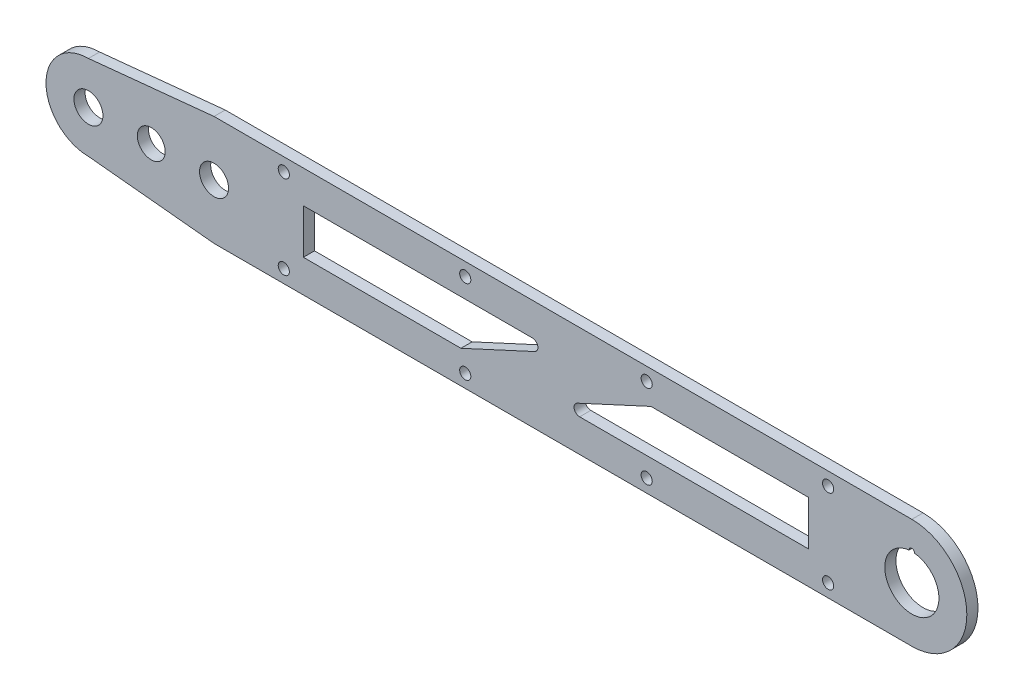
ISO-10303-21;
HEADER;
FILE_DESCRIPTION(('STEP AP214'),'2;1');
FILE_NAME('part.step','',(''),(''),'','','');
FILE_SCHEMA(('AUTOMOTIVE_DESIGN { 1 0 10303 214 1 1 1 1 }'));
ENDSEC;
DATA;
#1=APPLICATION_CONTEXT('core data for automotive mechanical design processes');
#2=APPLICATION_PROTOCOL_DEFINITION('international standard','automotive_design',2000,#1);
#3=PRODUCT_CONTEXT('',#1,'mechanical');
#4=PRODUCT('Part','Part','',(#3));
#5=PRODUCT_RELATED_PRODUCT_CATEGORY('part','',(#4));
#6=PRODUCT_DEFINITION_FORMATION('','',#4);
#7=PRODUCT_DEFINITION_CONTEXT('part definition',#1,'design');
#8=PRODUCT_DEFINITION('design','',#6,#7);
#9=PRODUCT_DEFINITION_SHAPE('','',#8);
#10=(LENGTH_UNIT() NAMED_UNIT(*) SI_UNIT(.MILLI.,.METRE.));
#11=(NAMED_UNIT(*) PLANE_ANGLE_UNIT() SI_UNIT($,.RADIAN.));
#12=(NAMED_UNIT(*) SI_UNIT($,.STERADIAN.) SOLID_ANGLE_UNIT());
#13=UNCERTAINTY_MEASURE_WITH_UNIT(LENGTH_MEASURE(1.E-05),#10,'distance_accuracy_value','');
#14=(GEOMETRIC_REPRESENTATION_CONTEXT(3) GLOBAL_UNCERTAINTY_ASSIGNED_CONTEXT((#13)) GLOBAL_UNIT_ASSIGNED_CONTEXT((#10,
#11,#12)) REPRESENTATION_CONTEXT('',''));
#15=CARTESIAN_POINT('',(0.,0.,0.));
#16=DIRECTION('',(0.,0.,1.));
#17=DIRECTION('',(1.,0.,0.));
#18=AXIS2_PLACEMENT_3D('',#15,#16,#17);
#19=CARTESIAN_POINT('',(-45.,0.,4.));
#20=DIRECTION('',(0.,0.,-1.));
#21=DIRECTION('',(-1.,0.,0.));
#22=AXIS2_PLACEMENT_3D('',#19,#20,#21);
#23=PLANE('',#22);
#24=DIRECTION('',(1.,0.,0.));
#25=VECTOR('',#24,1.);
#26=CARTESIAN_POINT('',(213.,-8.,4.));
#27=LINE('',#26,#25);
#28=CARTESIAN_POINT('',(130.976731594915,-8.,4.));
#29=VERTEX_POINT('',#28);
#30=CARTESIAN_POINT('',(213.,-8.,4.));
#31=VERTEX_POINT('',#30);
#32=EDGE_CURVE('E340',#29,#31,#27,.T.);
#33=ORIENTED_EDGE('',*,*,#32,.F.);
#34=CARTESIAN_POINT('',(130.976731594915,-6.,4.));
#35=DIRECTION('',(0.,0.,1.));
#36=DIRECTION('',(-1.,0.,0.));
#37=AXIS2_PLACEMENT_3D('',#34,#35,#36);
#38=CIRCLE('',#37,2.);
#39=CARTESIAN_POINT('',(130.138615239991,-4.18408123099903,4.));
#40=VERTEX_POINT('',#39);
#41=EDGE_CURVE('E61',#40,#29,#38,.T.);
#42=ORIENTED_EDGE('',*,*,#41,.F.);
#43=DIRECTION('',(-0.907959384500451,-0.419058177461749,0.));
#44=VECTOR('',#43,1.);
#45=CARTESIAN_POINT('',(130.138615239991,-4.18408123099903,4.));
#46=LINE('',#45,#44);
#47=CARTESIAN_POINT('',(156.537457907156,8.,4.));
#48=VERTEX_POINT('',#47);
#49=EDGE_CURVE('E353',#48,#40,#46,.T.);
#50=ORIENTED_EDGE('',*,*,#49,.F.);
#51=DIRECTION('',(-1.,0.,0.));
#52=VECTOR('',#51,1.);
#53=CARTESIAN_POINT('',(156.537457907156,8.,4.));
#54=LINE('',#53,#52);
#55=CARTESIAN_POINT('',(213.,8.,4.));
#56=VERTEX_POINT('',#55);
#57=EDGE_CURVE('E349',#56,#48,#54,.T.);
#58=ORIENTED_EDGE('',*,*,#57,.F.);
#59=DIRECTION('',(0.,1.,0.));
#60=VECTOR('',#59,1.);
#61=CARTESIAN_POINT('',(213.,8.,4.));
#62=LINE('',#61,#60);
#63=EDGE_CURVE('E345',#31,#56,#62,.T.);
#64=ORIENTED_EDGE('',*,*,#63,.F.);
#65=EDGE_LOOP('',(#33,#42,#50,#58,#64));
#66=FACE_BOUND('',#65,.T.);
#67=DIRECTION('',(0.,-1.,0.));
#68=VECTOR('',#67,1.);
#69=CARTESIAN_POINT('',(32.,8.,4.));
#70=LINE('',#69,#68);
#71=CARTESIAN_POINT('',(32.,8.,4.));
#72=VERTEX_POINT('',#71);
#73=CARTESIAN_POINT('',(32.,-8.,4.));
#74=VERTEX_POINT('',#73);
#75=EDGE_CURVE('E373',#72,#74,#70,.T.);
#76=ORIENTED_EDGE('',*,*,#75,.F.);
#77=DIRECTION('',(-1.,0.,0.));
#78=VECTOR('',#77,1.);
#79=CARTESIAN_POINT('',(114.023268405085,8.,4.));
#80=LINE('',#79,#78);
#81=CARTESIAN_POINT('',(114.023268405085,8.,4.));
#82=VERTEX_POINT('',#81);
#83=EDGE_CURVE('E335',#82,#72,#80,.T.);
#84=ORIENTED_EDGE('',*,*,#83,.F.);
#85=CARTESIAN_POINT('',(114.023268405086,6.,4.));
#86=DIRECTION('',(0.,0.,1.));
#87=DIRECTION('',(1.,0.,0.));
#88=AXIS2_PLACEMENT_3D('',#85,#86,#87);
#89=CIRCLE('',#88,2.);
#90=CARTESIAN_POINT('',(114.861384760009,4.18408123099903,4.));
#91=VERTEX_POINT('',#90);
#92=EDGE_CURVE('E385',#91,#82,#89,.T.);
#93=ORIENTED_EDGE('',*,*,#92,.F.);
#94=DIRECTION('',(0.907959384500451,0.419058177461749,0.));
#95=VECTOR('',#94,1.);
#96=CARTESIAN_POINT('',(88.4625420928446,-8.,4.));
#97=LINE('',#96,#95);
#98=CARTESIAN_POINT('',(88.4625420928446,-8.,4.));
#99=VERTEX_POINT('',#98);
#100=EDGE_CURVE('E381',#99,#91,#97,.T.);
#101=ORIENTED_EDGE('',*,*,#100,.F.);
#102=DIRECTION('',(1.,0.,0.));
#103=VECTOR('',#102,1.);
#104=CARTESIAN_POINT('',(32.,-8.,4.));
#105=LINE('',#104,#103);
#106=EDGE_CURVE('E377',#74,#99,#105,.T.);
#107=ORIENTED_EDGE('',*,*,#106,.F.);
#108=EDGE_LOOP('',(#76,#84,#93,#101,#107));
#109=FACE_BOUND('',#108,.T.);
#110=CARTESIAN_POINT('',(-22.5,0.,4.));
#111=DIRECTION('',(0.,0.,1.));
#112=DIRECTION('',(1.,0.,0.));
#113=AXIS2_PLACEMENT_3D('',#110,#111,#112);
#114=CIRCLE('',#113,5.);
#115=CARTESIAN_POINT('',(-17.5,0.,4.));
#116=VERTEX_POINT('',#115);
#117=EDGE_CURVE('E331',#116,#116,#114,.T.);
#118=ORIENTED_EDGE('',*,*,#117,.F.);
#119=EDGE_LOOP('',(#118));
#120=FACE_BOUND('',#119,.T.);
#121=CARTESIAN_POINT('',(90.0000000000003,-15.,4.));
#122=DIRECTION('',(0.,0.,1.));
#123=DIRECTION('',(1.,0.,0.));
#124=AXIS2_PLACEMENT_3D('',#121,#122,#123);
#125=CIRCLE('',#124,2.);
#126=CARTESIAN_POINT('',(92.0000000000003,-15.,4.));
#127=VERTEX_POINT('',#126);
#128=EDGE_CURVE('E408',#127,#127,#125,.T.);
#129=ORIENTED_EDGE('',*,*,#128,.F.);
#130=EDGE_LOOP('',(#129));
#131=FACE_BOUND('',#130,.T.);
#132=CARTESIAN_POINT('',(220.,15.,4.));
#133=DIRECTION('',(0.,0.,1.));
#134=DIRECTION('',(1.,0.,0.));
#135=AXIS2_PLACEMENT_3D('',#132,#133,#134);
#136=CIRCLE('',#135,2.);
#137=CARTESIAN_POINT('',(222.,15.,4.));
#138=VERTEX_POINT('',#137);
#139=EDGE_CURVE('E416',#138,#138,#136,.T.);
#140=ORIENTED_EDGE('',*,*,#139,.F.);
#141=EDGE_LOOP('',(#140));
#142=FACE_BOUND('',#141,.T.);
#143=CARTESIAN_POINT('',(155.,15.,4.));
#144=DIRECTION('',(0.,0.,1.));
#145=DIRECTION('',(1.,0.,0.));
#146=AXIS2_PLACEMENT_3D('',#143,#144,#145);
#147=CIRCLE('',#146,2.);
#148=CARTESIAN_POINT('',(157.,15.,4.));
#149=VERTEX_POINT('',#148);
#150=EDGE_CURVE('E420',#149,#149,#147,.T.);
#151=ORIENTED_EDGE('',*,*,#150,.F.);
#152=EDGE_LOOP('',(#151));
#153=FACE_BOUND('',#152,.T.);
#154=CARTESIAN_POINT('',(90.,15.,4.));
#155=DIRECTION('',(0.,0.,1.));
#156=DIRECTION('',(1.,0.,0.));
#157=AXIS2_PLACEMENT_3D('',#154,#155,#156);
#158=CIRCLE('',#157,2.);
#159=CARTESIAN_POINT('',(92.,15.,4.));
#160=VERTEX_POINT('',#159);
#161=EDGE_CURVE('E424',#160,#160,#158,.T.);
#162=ORIENTED_EDGE('',*,*,#161,.F.);
#163=EDGE_LOOP('',(#162));
#164=FACE_BOUND('',#163,.T.);
#165=CARTESIAN_POINT('',(155.,-15.,4.));
#166=DIRECTION('',(0.,0.,1.));
#167=DIRECTION('',(1.,0.,0.));
#168=AXIS2_PLACEMENT_3D('',#165,#166,#167);
#169=CIRCLE('',#168,2.);
#170=CARTESIAN_POINT('',(157.,-15.,4.));
#171=VERTEX_POINT('',#170);
#172=EDGE_CURVE('E404',#171,#171,#169,.T.);
#173=ORIENTED_EDGE('',*,*,#172,.F.);
#174=EDGE_LOOP('',(#173));
#175=FACE_BOUND('',#174,.T.);
#176=CARTESIAN_POINT('',(220.,-15.,4.));
#177=DIRECTION('',(0.,0.,1.));
#178=DIRECTION('',(1.,0.,0.));
#179=AXIS2_PLACEMENT_3D('',#176,#177,#178);
#180=CIRCLE('',#179,2.);
#181=CARTESIAN_POINT('',(222.,-15.,4.));
#182=VERTEX_POINT('',#181);
#183=EDGE_CURVE('E409',#182,#182,#180,.T.);
#184=ORIENTED_EDGE('',*,*,#183,.F.);
#185=EDGE_LOOP('',(#184));
#186=FACE_BOUND('',#185,.T.);
#187=CARTESIAN_POINT('',(25.0000000000003,-15.,4.));
#188=DIRECTION('',(0.,0.,1.));
#189=DIRECTION('',(1.,0.,0.));
#190=AXIS2_PLACEMENT_3D('',#187,#188,#189);
#191=CIRCLE('',#190,2.);
#192=CARTESIAN_POINT('',(27.0000000000003,-15.,4.));
#193=VERTEX_POINT('',#192);
#194=EDGE_CURVE('E294',#193,#193,#191,.T.);
#195=ORIENTED_EDGE('',*,*,#194,.F.);
#196=EDGE_LOOP('',(#195));
#197=FACE_BOUND('',#196,.T.);
#198=CARTESIAN_POINT('',(25.,15.,4.));
#199=DIRECTION('',(0.,0.,1.));
#200=DIRECTION('',(1.,0.,0.));
#201=AXIS2_PLACEMENT_3D('',#198,#199,#200);
#202=CIRCLE('',#201,2.);
#203=CARTESIAN_POINT('',(27.,15.,4.));
#204=VERTEX_POINT('',#203);
#205=EDGE_CURVE('E262',#204,#204,#202,.T.);
#206=ORIENTED_EDGE('',*,*,#205,.F.);
#207=EDGE_LOOP('',(#206));
#208=FACE_BOUND('',#207,.T.);
#209=CARTESIAN_POINT('',(-45.,0.,4.));
#210=DIRECTION('',(0.,0.,1.));
#211=DIRECTION('',(-1.,0.,0.));
#212=AXIS2_PLACEMENT_3D('',#209,#210,#211);
#213=CIRCLE('',#212,15.2);
#214=CARTESIAN_POINT('',(-45.,15.2,4.));
#215=VERTEX_POINT('',#214);
#216=CARTESIAN_POINT('',(-45.,-15.2,4.));
#217=VERTEX_POINT('',#216);
#218=EDGE_CURVE('E195',#215,#217,#213,.T.);
#219=ORIENTED_EDGE('',*,*,#218,.T.);
#220=DIRECTION('',(0.995037190209989,-0.0995037190209987,0.));
#221=VECTOR('',#220,1.);
#222=CARTESIAN_POINT('',(-45.,-15.2,4.));
#223=LINE('',#222,#221);
#224=CARTESIAN_POINT('',(0.,-19.7,4.));
#225=VERTEX_POINT('',#224);
#226=EDGE_CURVE('E199',#217,#225,#223,.T.);
#227=ORIENTED_EDGE('',*,*,#226,.T.);
#228=DIRECTION('',(1.,0.,0.));
#229=VECTOR('',#228,1.);
#230=CARTESIAN_POINT('',(0.,-19.7,4.));
#231=LINE('',#230,#229);
#232=CARTESIAN_POINT('',(250.,-19.7,4.));
#233=VERTEX_POINT('',#232);
#234=EDGE_CURVE('E203',#225,#233,#231,.T.);
#235=ORIENTED_EDGE('',*,*,#234,.T.);
#236=CARTESIAN_POINT('',(250.,0.,4.));
#237=DIRECTION('',(0.,0.,1.));
#238=DIRECTION('',(1.,0.,0.));
#239=AXIS2_PLACEMENT_3D('',#236,#237,#238);
#240=CIRCLE('',#239,19.7);
#241=CARTESIAN_POINT('',(250.,19.7,4.));
#242=VERTEX_POINT('',#241);
#243=EDGE_CURVE('E206',#233,#242,#240,.T.);
#244=ORIENTED_EDGE('',*,*,#243,.T.);
#245=DIRECTION('',(-1.,0.,0.));
#246=VECTOR('',#245,1.);
#247=CARTESIAN_POINT('',(250.,19.7,4.));
#248=LINE('',#247,#246);
#249=CARTESIAN_POINT('',(0.,19.7,4.));
#250=VERTEX_POINT('',#249);
#251=EDGE_CURVE('E209',#242,#250,#248,.T.);
#252=ORIENTED_EDGE('',*,*,#251,.T.);
#253=DIRECTION('',(-0.995037190209989,-0.099503719020999,0.));
#254=VECTOR('',#253,1.);
#255=CARTESIAN_POINT('',(0.,19.7,4.));
#256=LINE('',#255,#254);
#257=EDGE_CURVE('E212',#250,#215,#256,.T.);
#258=ORIENTED_EDGE('',*,*,#257,.T.);
#259=EDGE_LOOP('',(#219,#227,#235,#244,#252,#258));
#260=FACE_BOUND('',#259,.T.);
#261=CARTESIAN_POINT('',(0.,0.,4.));
#262=DIRECTION('',(0.,0.,1.));
#263=DIRECTION('',(1.,0.,0.));
#264=AXIS2_PLACEMENT_3D('',#261,#262,#263);
#265=CIRCLE('',#264,5.2);
#266=CARTESIAN_POINT('',(5.2,0.,4.));
#267=VERTEX_POINT('',#266);
#268=EDGE_CURVE('E183',#267,#267,#265,.T.);
#269=ORIENTED_EDGE('',*,*,#268,.F.);
#270=EDGE_LOOP('',(#269));
#271=FACE_BOUND('',#270,.T.);
#272=CARTESIAN_POINT('',(250.,0.,4.));
#273=DIRECTION('',(0.,0.,1.));
#274=DIRECTION('',(1.,0.,0.));
#275=AXIS2_PLACEMENT_3D('',#272,#273,#274);
#276=CIRCLE('',#275,9.7);
#277=CARTESIAN_POINT('',(249.001329398902,9.64845360824742,4.));
#278=VERTEX_POINT('',#277);
#279=CARTESIAN_POINT('',(250.998670601098,9.64845360824742,4.));
#280=VERTEX_POINT('',#279);
#281=EDGE_CURVE('E172',#278,#280,#276,.T.);
#282=ORIENTED_EDGE('',*,*,#281,.F.);
#283=CARTESIAN_POINT('',(250.,9.69999999999999,4.));
#284=DIRECTION('',(0.,0.,1.));
#285=DIRECTION('',(1.,0.,0.));
#286=AXIS2_PLACEMENT_3D('',#283,#284,#285);
#287=CIRCLE('',#286,0.999999999999998);
#288=EDGE_CURVE('E53',#280,#278,#287,.T.);
#289=ORIENTED_EDGE('',*,*,#288,.F.);
#290=EDGE_LOOP('',(#282,#289));
#291=FACE_BOUND('',#290,.T.);
#292=CARTESIAN_POINT('',(-45.,0.,4.));
#293=DIRECTION('',(0.,0.,1.));
#294=DIRECTION('',(1.,0.,0.));
#295=AXIS2_PLACEMENT_3D('',#292,#293,#294);
#296=CIRCLE('',#295,5.20000000000001);
#297=CARTESIAN_POINT('',(-39.8,0.,4.));
#298=VERTEX_POINT('',#297);
#299=EDGE_CURVE('E185',#298,#298,#296,.T.);
#300=ORIENTED_EDGE('',*,*,#299,.F.);
#301=EDGE_LOOP('',(#300));
#302=FACE_BOUND('',#301,.T.);
#303=ADVANCED_FACE('F38',(#66,#109,#120,#131,#142,#153,#164,#175,#186,#197,#208,#260,#271,#291,
#302),#23,.F.);
#304=CARTESIAN_POINT('',(-45.,0.,0.));
#305=DIRECTION('',(0.,0.,-1.));
#306=DIRECTION('',(-1.,0.,0.));
#307=AXIS2_PLACEMENT_3D('',#304,#305,#306);
#308=PLANE('',#307);
#309=CARTESIAN_POINT('',(250.,9.69999999999999,0.));
#310=DIRECTION('',(0.,0.,-1.));
#311=DIRECTION('',(-1.,0.,0.));
#312=AXIS2_PLACEMENT_3D('',#309,#310,#311);
#313=CIRCLE('',#312,0.999999999999998);
#314=CARTESIAN_POINT('',(249.001329398902,9.64845360824742,0.));
#315=VERTEX_POINT('',#314);
#316=CARTESIAN_POINT('',(250.998670601098,9.64845360824742,0.));
#317=VERTEX_POINT('',#316);
#318=EDGE_CURVE('E164',#315,#317,#313,.T.);
#319=ORIENTED_EDGE('',*,*,#318,.F.);
#320=CARTESIAN_POINT('',(250.,0.,0.));
#321=DIRECTION('',(0.,0.,1.));
#322=DIRECTION('',(1.,0.,0.));
#323=AXIS2_PLACEMENT_3D('',#320,#321,#322);
#324=CIRCLE('',#323,9.7);
#325=EDGE_CURVE('E178',#315,#317,#324,.T.);
#326=ORIENTED_EDGE('',*,*,#325,.T.);
#327=EDGE_LOOP('',(#319,#326));
#328=FACE_BOUND('',#327,.T.);
#329=CARTESIAN_POINT('',(130.976731594915,-6.,0.));
#330=DIRECTION('',(0.,0.,-1.));
#331=DIRECTION('',(-1.,0.,0.));
#332=AXIS2_PLACEMENT_3D('',#329,#330,#331);
#333=CIRCLE('',#332,2.);
#334=CARTESIAN_POINT('',(130.976731594915,-8.,0.));
#335=VERTEX_POINT('',#334);
#336=CARTESIAN_POINT('',(130.138615239991,-4.18408123099903,0.));
#337=VERTEX_POINT('',#336);
#338=EDGE_CURVE('E324',#335,#337,#333,.T.);
#339=ORIENTED_EDGE('',*,*,#338,.F.);
#340=DIRECTION('',(-1.,0.,0.));
#341=VECTOR('',#340,1.);
#342=CARTESIAN_POINT('',(-45.,-8.,0.));
#343=LINE('',#342,#341);
#344=CARTESIAN_POINT('',(213.,-8.,0.));
#345=VERTEX_POINT('',#344);
#346=EDGE_CURVE('E311',#345,#335,#343,.T.);
#347=ORIENTED_EDGE('',*,*,#346,.F.);
#348=DIRECTION('',(0.,-1.,0.));
#349=VECTOR('',#348,1.);
#350=CARTESIAN_POINT('',(213.,0.,0.));
#351=LINE('',#350,#349);
#352=CARTESIAN_POINT('',(213.,8.,0.));
#353=VERTEX_POINT('',#352);
#354=EDGE_CURVE('E314',#353,#345,#351,.T.);
#355=ORIENTED_EDGE('',*,*,#354,.F.);
#356=DIRECTION('',(1.,0.,0.));
#357=VECTOR('',#356,1.);
#358=CARTESIAN_POINT('',(-45.,8.,0.));
#359=LINE('',#358,#357);
#360=CARTESIAN_POINT('',(156.537457907156,8.,0.));
#361=VERTEX_POINT('',#360);
#362=EDGE_CURVE('E318',#361,#353,#359,.T.);
#363=ORIENTED_EDGE('',*,*,#362,.F.);
#364=DIRECTION('',(0.907959384500451,0.419058177461749,0.));
#365=VECTOR('',#364,1.);
#366=CARTESIAN_POINT('',(-12.651958611426,-70.0874230085766,0.));
#367=LINE('',#366,#365);
#368=EDGE_CURVE('E321',#337,#361,#367,.T.);
#369=ORIENTED_EDGE('',*,*,#368,.F.);
#370=EDGE_LOOP('',(#339,#347,#355,#363,#369));
#371=FACE_BOUND('',#370,.T.);
#372=DIRECTION('',(1.,0.,0.));
#373=VECTOR('',#372,1.);
#374=CARTESIAN_POINT('',(-45.,8.,0.));
#375=LINE('',#374,#373);
#376=CARTESIAN_POINT('',(32.,8.,0.));
#377=VERTEX_POINT('',#376);
#378=CARTESIAN_POINT('',(114.023268405085,8.,0.));
#379=VERTEX_POINT('',#378);
#380=EDGE_CURVE('E308',#377,#379,#375,.T.);
#381=ORIENTED_EDGE('',*,*,#380,.F.);
#382=DIRECTION('',(0.,1.,0.));
#383=VECTOR('',#382,1.);
#384=CARTESIAN_POINT('',(32.,0.,0.));
#385=LINE('',#384,#383);
#386=CARTESIAN_POINT('',(32.,-8.,0.));
#387=VERTEX_POINT('',#386);
#388=EDGE_CURVE('E256',#387,#377,#385,.T.);
#389=ORIENTED_EDGE('',*,*,#388,.F.);
#390=DIRECTION('',(-1.,0.,0.));
#391=VECTOR('',#390,1.);
#392=CARTESIAN_POINT('',(-45.,-8.,0.));
#393=LINE('',#392,#391);
#394=CARTESIAN_POINT('',(88.4625420928446,-8.,0.));
#395=VERTEX_POINT('',#394);
#396=EDGE_CURVE('E298',#395,#387,#393,.T.);
#397=ORIENTED_EDGE('',*,*,#396,.F.);
#398=DIRECTION('',(-0.907959384500451,-0.419058177461749,0.));
#399=VECTOR('',#398,1.);
#400=CARTESIAN_POINT('',(-18.5187730958905,-57.3759916255703,0.));
#401=LINE('',#400,#399);
#402=CARTESIAN_POINT('',(114.861384760009,4.18408123099903,0.));
#403=VERTEX_POINT('',#402);
#404=EDGE_CURVE('E302',#403,#395,#401,.T.);
#405=ORIENTED_EDGE('',*,*,#404,.F.);
#406=CARTESIAN_POINT('',(114.023268405086,6.,0.));
#407=DIRECTION('',(0.,0.,-1.));
#408=DIRECTION('',(-1.,0.,0.));
#409=AXIS2_PLACEMENT_3D('',#406,#407,#408);
#410=CIRCLE('',#409,2.);
#411=EDGE_CURVE('E305',#379,#403,#410,.T.);
#412=ORIENTED_EDGE('',*,*,#411,.F.);
#413=EDGE_LOOP('',(#381,#389,#397,#405,#412));
#414=FACE_BOUND('',#413,.T.);
#415=CARTESIAN_POINT('',(-22.5,0.,0.));
#416=DIRECTION('',(0.,0.,-1.));
#417=DIRECTION('',(-1.,0.,0.));
#418=AXIS2_PLACEMENT_3D('',#415,#416,#417);
#419=CIRCLE('',#418,5.);
#420=CARTESIAN_POINT('',(-27.5,0.,0.));
#421=VERTEX_POINT('',#420);
#422=EDGE_CURVE('E290',#421,#421,#419,.T.);
#423=ORIENTED_EDGE('',*,*,#422,.F.);
#424=EDGE_LOOP('',(#423));
#425=FACE_BOUND('',#424,.T.);
#426=CARTESIAN_POINT('',(90.0000000000003,-15.,0.));
#427=DIRECTION('',(0.,0.,-1.));
#428=DIRECTION('',(-1.,0.,0.));
#429=AXIS2_PLACEMENT_3D('',#426,#427,#428);
#430=CIRCLE('',#429,2.);
#431=CARTESIAN_POINT('',(88.0000000000003,-15.,0.));
#432=VERTEX_POINT('',#431);
#433=EDGE_CURVE('E286',#432,#432,#430,.T.);
#434=ORIENTED_EDGE('',*,*,#433,.F.);
#435=EDGE_LOOP('',(#434));
#436=FACE_BOUND('',#435,.T.);
#437=CARTESIAN_POINT('',(220.,15.,0.));
#438=DIRECTION('',(0.,0.,-1.));
#439=DIRECTION('',(-1.,0.,0.));
#440=AXIS2_PLACEMENT_3D('',#437,#438,#439);
#441=CIRCLE('',#440,2.);
#442=CARTESIAN_POINT('',(218.,15.,0.));
#443=VERTEX_POINT('',#442);
#444=EDGE_CURVE('E282',#443,#443,#441,.T.);
#445=ORIENTED_EDGE('',*,*,#444,.F.);
#446=EDGE_LOOP('',(#445));
#447=FACE_BOUND('',#446,.T.);
#448=CARTESIAN_POINT('',(155.,15.,0.));
#449=DIRECTION('',(0.,0.,-1.));
#450=DIRECTION('',(-1.,0.,0.));
#451=AXIS2_PLACEMENT_3D('',#448,#449,#450);
#452=CIRCLE('',#451,2.);
#453=CARTESIAN_POINT('',(153.,15.,0.));
#454=VERTEX_POINT('',#453);
#455=EDGE_CURVE('E278',#454,#454,#452,.T.);
#456=ORIENTED_EDGE('',*,*,#455,.F.);
#457=EDGE_LOOP('',(#456));
#458=FACE_BOUND('',#457,.T.);
#459=CARTESIAN_POINT('',(90.,15.,0.));
#460=DIRECTION('',(0.,0.,-1.));
#461=DIRECTION('',(-1.,0.,0.));
#462=AXIS2_PLACEMENT_3D('',#459,#460,#461);
#463=CIRCLE('',#462,2.);
#464=CARTESIAN_POINT('',(88.,15.,0.));
#465=VERTEX_POINT('',#464);
#466=EDGE_CURVE('E274',#465,#465,#463,.T.);
#467=ORIENTED_EDGE('',*,*,#466,.F.);
#468=EDGE_LOOP('',(#467));
#469=FACE_BOUND('',#468,.T.);
#470=CARTESIAN_POINT('',(155.,-15.,0.));
#471=DIRECTION('',(0.,0.,-1.));
#472=DIRECTION('',(-1.,0.,0.));
#473=AXIS2_PLACEMENT_3D('',#470,#471,#472);
#474=CIRCLE('',#473,2.);
#475=CARTESIAN_POINT('',(153.,-15.,0.));
#476=VERTEX_POINT('',#475);
#477=EDGE_CURVE('E270',#476,#476,#474,.T.);
#478=ORIENTED_EDGE('',*,*,#477,.F.);
#479=EDGE_LOOP('',(#478));
#480=FACE_BOUND('',#479,.T.);
#481=CARTESIAN_POINT('',(220.,-15.,0.));
#482=DIRECTION('',(0.,0.,-1.));
#483=DIRECTION('',(-1.,0.,0.));
#484=AXIS2_PLACEMENT_3D('',#481,#482,#483);
#485=CIRCLE('',#484,2.);
#486=CARTESIAN_POINT('',(218.,-15.,0.));
#487=VERTEX_POINT('',#486);
#488=EDGE_CURVE('E266',#487,#487,#485,.T.);
#489=ORIENTED_EDGE('',*,*,#488,.F.);
#490=EDGE_LOOP('',(#489));
#491=FACE_BOUND('',#490,.T.);
#492=CARTESIAN_POINT('',(25.0000000000003,-15.,0.));
#493=DIRECTION('',(0.,0.,-1.));
#494=DIRECTION('',(-1.,0.,0.));
#495=AXIS2_PLACEMENT_3D('',#492,#493,#494);
#496=CIRCLE('',#495,2.);
#497=CARTESIAN_POINT('',(23.0000000000003,-15.,0.));
#498=VERTEX_POINT('',#497);
#499=EDGE_CURVE('E261',#498,#498,#496,.T.);
#500=ORIENTED_EDGE('',*,*,#499,.F.);
#501=EDGE_LOOP('',(#500));
#502=FACE_BOUND('',#501,.T.);
#503=CARTESIAN_POINT('',(25.,15.,0.));
#504=DIRECTION('',(0.,0.,-1.));
#505=DIRECTION('',(-1.,0.,0.));
#506=AXIS2_PLACEMENT_3D('',#503,#504,#505);
#507=CIRCLE('',#506,2.);
#508=CARTESIAN_POINT('',(23.,15.,0.));
#509=VERTEX_POINT('',#508);
#510=EDGE_CURVE('E257',#509,#509,#507,.T.);
#511=ORIENTED_EDGE('',*,*,#510,.F.);
#512=EDGE_LOOP('',(#511));
#513=FACE_BOUND('',#512,.T.);
#514=CARTESIAN_POINT('',(-45.,0.,0.));
#515=DIRECTION('',(0.,0.,1.));
#516=DIRECTION('',(-1.,0.,0.));
#517=AXIS2_PLACEMENT_3D('',#514,#515,#516);
#518=CIRCLE('',#517,15.2);
#519=CARTESIAN_POINT('',(-45.,15.2,0.));
#520=VERTEX_POINT('',#519);
#521=CARTESIAN_POINT('',(-45.,-15.2,0.));
#522=VERTEX_POINT('',#521);
#523=EDGE_CURVE('E193',#520,#522,#518,.T.);
#524=ORIENTED_EDGE('',*,*,#523,.F.);
#525=DIRECTION('',(-0.995037190209989,-0.099503719020999,0.));
#526=VECTOR('',#525,1.);
#527=CARTESIAN_POINT('',(0.,19.7,0.));
#528=LINE('',#527,#526);
#529=CARTESIAN_POINT('',(0.,19.7,0.));
#530=VERTEX_POINT('',#529);
#531=EDGE_CURVE('E200',#530,#520,#528,.T.);
#532=ORIENTED_EDGE('',*,*,#531,.F.);
#533=DIRECTION('',(-1.,0.,0.));
#534=VECTOR('',#533,1.);
#535=CARTESIAN_POINT('',(250.,19.7,0.));
#536=LINE('',#535,#534);
#537=CARTESIAN_POINT('',(250.,19.7,0.));
#538=VERTEX_POINT('',#537);
#539=EDGE_CURVE('E228',#538,#530,#536,.T.);
#540=ORIENTED_EDGE('',*,*,#539,.F.);
#541=CARTESIAN_POINT('',(250.,0.,0.));
#542=DIRECTION('',(0.,0.,1.));
#543=DIRECTION('',(1.,0.,0.));
#544=AXIS2_PLACEMENT_3D('',#541,#542,#543);
#545=CIRCLE('',#544,19.7);
#546=CARTESIAN_POINT('',(250.,-19.7,0.));
#547=VERTEX_POINT('',#546);
#548=EDGE_CURVE('E225',#547,#538,#545,.T.);
#549=ORIENTED_EDGE('',*,*,#548,.F.);
#550=DIRECTION('',(1.,0.,0.));
#551=VECTOR('',#550,1.);
#552=CARTESIAN_POINT('',(0.,-19.7,0.));
#553=LINE('',#552,#551);
#554=CARTESIAN_POINT('',(0.,-19.7,0.));
#555=VERTEX_POINT('',#554);
#556=EDGE_CURVE('E222',#555,#547,#553,.T.);
#557=ORIENTED_EDGE('',*,*,#556,.F.);
#558=DIRECTION('',(0.995037190209989,-0.0995037190209987,0.));
#559=VECTOR('',#558,1.);
#560=CARTESIAN_POINT('',(-45.,-15.2,0.));
#561=LINE('',#560,#559);
#562=EDGE_CURVE('E219',#522,#555,#561,.T.);
#563=ORIENTED_EDGE('',*,*,#562,.F.);
#564=EDGE_LOOP('',(#524,#532,#540,#549,#557,#563));
#565=FACE_BOUND('',#564,.T.);
#566=CARTESIAN_POINT('',(0.,0.,0.));
#567=DIRECTION('',(0.,0.,1.));
#568=DIRECTION('',(1.,0.,0.));
#569=AXIS2_PLACEMENT_3D('',#566,#567,#568);
#570=CIRCLE('',#569,5.2);
#571=CARTESIAN_POINT('',(5.2,0.,0.));
#572=VERTEX_POINT('',#571);
#573=EDGE_CURVE('E177',#572,#572,#570,.T.);
#574=ORIENTED_EDGE('',*,*,#573,.T.);
#575=EDGE_LOOP('',(#574));
#576=FACE_BOUND('',#575,.T.);
#577=CARTESIAN_POINT('',(-45.,0.,0.));
#578=DIRECTION('',(0.,0.,1.));
#579=DIRECTION('',(1.,0.,0.));
#580=AXIS2_PLACEMENT_3D('',#577,#578,#579);
#581=CIRCLE('',#580,5.20000000000001);
#582=CARTESIAN_POINT('',(-39.8,0.,0.));
#583=VERTEX_POINT('',#582);
#584=EDGE_CURVE('E188',#583,#583,#581,.T.);
#585=ORIENTED_EDGE('',*,*,#584,.T.);
#586=EDGE_LOOP('',(#585));
#587=FACE_BOUND('',#586,.T.);
#588=ADVANCED_FACE('F328',(#328,#371,#414,#425,#436,#447,#458,#469,#480,#491,#502,#513,#565,
#576,#587),#308,.T.);
#589=CARTESIAN_POINT('',(-45.,0.,4.));
#590=DIRECTION('',(0.,0.,-1.));
#591=DIRECTION('',(-1.,0.,0.));
#592=AXIS2_PLACEMENT_3D('',#589,#590,#591);
#593=CYLINDRICAL_SURFACE('',#592,15.2);
#594=ORIENTED_EDGE('',*,*,#523,.T.);
#595=DIRECTION('',(0.,0.,-1.));
#596=VECTOR('',#595,1.);
#597=CARTESIAN_POINT('',(-45.,-15.2,4.));
#598=LINE('',#597,#596);
#599=EDGE_CURVE('E252',#217,#522,#598,.T.);
#600=ORIENTED_EDGE('',*,*,#599,.F.);
#601=ORIENTED_EDGE('',*,*,#218,.F.);
#602=DIRECTION('',(0.,0.,-1.));
#603=VECTOR('',#602,1.);
#604=CARTESIAN_POINT('',(-45.,15.2,4.));
#605=LINE('',#604,#603);
#606=EDGE_CURVE('E215',#215,#520,#605,.T.);
#607=ORIENTED_EDGE('',*,*,#606,.T.);
#608=EDGE_LOOP('',(#594,#600,#601,#607));
#609=FACE_BOUND('',#608,.T.);
#610=ADVANCED_FACE('F40',(#609),#593,.T.);
#611=CARTESIAN_POINT('',(-45.,-15.2,4.));
#612=DIRECTION('',(0.0995037190209987,0.995037190209989,0.));
#613=DIRECTION('',(-0.995037190209989,0.0995037190209987,0.));
#614=AXIS2_PLACEMENT_3D('',#611,#612,#613);
#615=PLANE('',#614);
#616=ORIENTED_EDGE('',*,*,#562,.T.);
#617=DIRECTION('',(0.,0.,-1.));
#618=VECTOR('',#617,1.);
#619=CARTESIAN_POINT('',(0.,-19.7,4.));
#620=LINE('',#619,#618);
#621=EDGE_CURVE('E248',#225,#555,#620,.T.);
#622=ORIENTED_EDGE('',*,*,#621,.F.);
#623=ORIENTED_EDGE('',*,*,#226,.F.);
#624=ORIENTED_EDGE('',*,*,#599,.T.);
#625=EDGE_LOOP('',(#616,#622,#623,#624));
#626=FACE_BOUND('',#625,.T.);
#627=ADVANCED_FACE('F482',(#626),#615,.F.);
#628=CARTESIAN_POINT('',(0.,-19.7,4.));
#629=DIRECTION('',(0.,1.,0.));
#630=DIRECTION('',(-1.,0.,0.));
#631=AXIS2_PLACEMENT_3D('',#628,#629,#630);
#632=PLANE('',#631);
#633=ORIENTED_EDGE('',*,*,#556,.T.);
#634=DIRECTION('',(0.,0.,-1.));
#635=VECTOR('',#634,1.);
#636=CARTESIAN_POINT('',(250.,-19.7,4.));
#637=LINE('',#636,#635);
#638=EDGE_CURVE('E244',#233,#547,#637,.T.);
#639=ORIENTED_EDGE('',*,*,#638,.F.);
#640=ORIENTED_EDGE('',*,*,#234,.F.);
#641=ORIENTED_EDGE('',*,*,#621,.T.);
#642=EDGE_LOOP('',(#633,#639,#640,#641));
#643=FACE_BOUND('',#642,.T.);
#644=ADVANCED_FACE('F479',(#643),#632,.F.);
#645=CARTESIAN_POINT('',(250.,0.,4.));
#646=DIRECTION('',(0.,0.,-1.));
#647=DIRECTION('',(-1.,0.,0.));
#648=AXIS2_PLACEMENT_3D('',#645,#646,#647);
#649=CYLINDRICAL_SURFACE('',#648,19.7);
#650=ORIENTED_EDGE('',*,*,#548,.T.);
#651=DIRECTION('',(0.,0.,-1.));
#652=VECTOR('',#651,1.);
#653=CARTESIAN_POINT('',(250.,19.7,4.));
#654=LINE('',#653,#652);
#655=EDGE_CURVE('E240',#242,#538,#654,.T.);
#656=ORIENTED_EDGE('',*,*,#655,.F.);
#657=ORIENTED_EDGE('',*,*,#243,.F.);
#658=ORIENTED_EDGE('',*,*,#638,.T.);
#659=EDGE_LOOP('',(#650,#656,#657,#658));
#660=FACE_BOUND('',#659,.T.);
#661=ADVANCED_FACE('F475',(#660),#649,.T.);
#662=CARTESIAN_POINT('',(250.,19.7,4.));
#663=DIRECTION('',(0.,-1.,0.));
#664=DIRECTION('',(1.,0.,0.));
#665=AXIS2_PLACEMENT_3D('',#662,#663,#664);
#666=PLANE('',#665);
#667=ORIENTED_EDGE('',*,*,#539,.T.);
#668=DIRECTION('',(0.,0.,-1.));
#669=VECTOR('',#668,1.);
#670=CARTESIAN_POINT('',(0.,19.7,4.));
#671=LINE('',#670,#669);
#672=EDGE_CURVE('E236',#250,#530,#671,.T.);
#673=ORIENTED_EDGE('',*,*,#672,.F.);
#674=ORIENTED_EDGE('',*,*,#251,.F.);
#675=ORIENTED_EDGE('',*,*,#655,.T.);
#676=EDGE_LOOP('',(#667,#673,#674,#675));
#677=FACE_BOUND('',#676,.T.);
#678=ADVANCED_FACE('F471',(#677),#666,.F.);
#679=CARTESIAN_POINT('',(0.,19.7,4.));
#680=DIRECTION('',(0.099503719020999,-0.995037190209989,0.));
#681=DIRECTION('',(0.995037190209989,0.099503719020999,0.));
#682=AXIS2_PLACEMENT_3D('',#679,#680,#681);
#683=PLANE('',#682);
#684=ORIENTED_EDGE('',*,*,#531,.T.);
#685=ORIENTED_EDGE('',*,*,#606,.F.);
#686=ORIENTED_EDGE('',*,*,#257,.F.);
#687=ORIENTED_EDGE('',*,*,#672,.T.);
#688=EDGE_LOOP('',(#684,#685,#686,#687));
#689=FACE_BOUND('',#688,.T.);
#690=ADVANCED_FACE('F468',(#689),#683,.F.);
#691=CARTESIAN_POINT('',(0.,0.,4.));
#692=DIRECTION('',(0.,0.,-1.));
#693=DIRECTION('',(-1.,0.,0.));
#694=AXIS2_PLACEMENT_3D('',#691,#692,#693);
#695=CYLINDRICAL_SURFACE('',#694,5.2);
#696=ORIENTED_EDGE('',*,*,#268,.T.);
#697=EDGE_LOOP('',(#696));
#698=FACE_BOUND('',#697,.T.);
#699=ORIENTED_EDGE('',*,*,#573,.F.);
#700=EDGE_LOOP('',(#699));
#701=FACE_BOUND('',#700,.T.);
#702=ADVANCED_FACE('F454',(#698,#701),#695,.F.);
#703=CARTESIAN_POINT('',(250.,0.,4.));
#704=DIRECTION('',(0.,0.,-1.));
#705=DIRECTION('',(-1.,0.,0.));
#706=AXIS2_PLACEMENT_3D('',#703,#704,#705);
#707=CYLINDRICAL_SURFACE('',#706,9.7);
#708=DIRECTION('',(0.,0.,1.));
#709=VECTOR('',#708,1.);
#710=CARTESIAN_POINT('',(250.998670601098,9.64845360824742,-1.));
#711=LINE('',#710,#709);
#712=EDGE_CURVE('E11',#317,#280,#711,.T.);
#713=ORIENTED_EDGE('',*,*,#712,.F.);
#714=ORIENTED_EDGE('',*,*,#325,.F.);
#715=DIRECTION('',(0.,0.,1.));
#716=VECTOR('',#715,1.);
#717=CARTESIAN_POINT('',(249.001329398902,9.64845360824742,-1.));
#718=LINE('',#717,#716);
#719=EDGE_CURVE('E47',#278,#315,#718,.F.);
#720=ORIENTED_EDGE('',*,*,#719,.F.);
#721=ORIENTED_EDGE('',*,*,#281,.T.);
#722=EDGE_LOOP('',(#713,#714,#720,#721));
#723=FACE_BOUND('',#722,.T.);
#724=ADVANCED_FACE('F175',(#723),#707,.F.);
#725=CARTESIAN_POINT('',(-45.,0.,4.));
#726=DIRECTION('',(0.,0.,-1.));
#727=DIRECTION('',(-1.,0.,0.));
#728=AXIS2_PLACEMENT_3D('',#725,#726,#727);
#729=CYLINDRICAL_SURFACE('',#728,5.20000000000001);
#730=ORIENTED_EDGE('',*,*,#299,.T.);
#731=EDGE_LOOP('',(#730));
#732=FACE_BOUND('',#731,.T.);
#733=ORIENTED_EDGE('',*,*,#584,.F.);
#734=EDGE_LOOP('',(#733));
#735=FACE_BOUND('',#734,.T.);
#736=ADVANCED_FACE('F442',(#732,#735),#729,.F.);
#737=CARTESIAN_POINT('',(25.,15.,-6.));
#738=DIRECTION('',(0.,0.,1.));
#739=DIRECTION('',(1.,0.,0.));
#740=AXIS2_PLACEMENT_3D('',#737,#738,#739);
#741=CYLINDRICAL_SURFACE('',#740,2.);
#742=ORIENTED_EDGE('',*,*,#510,.T.);
#743=EDGE_LOOP('',(#742));
#744=FACE_BOUND('',#743,.T.);
#745=ORIENTED_EDGE('',*,*,#205,.T.);
#746=EDGE_LOOP('',(#745));
#747=FACE_BOUND('',#746,.T.);
#748=ADVANCED_FACE('F444',(#744,#747),#741,.F.);
#749=CARTESIAN_POINT('',(25.0000000000003,-15.,-6.));
#750=DIRECTION('',(0.,0.,1.));
#751=DIRECTION('',(1.,0.,0.));
#752=AXIS2_PLACEMENT_3D('',#749,#750,#751);
#753=CYLINDRICAL_SURFACE('',#752,2.);
#754=ORIENTED_EDGE('',*,*,#499,.T.);
#755=EDGE_LOOP('',(#754));
#756=FACE_BOUND('',#755,.T.);
#757=ORIENTED_EDGE('',*,*,#194,.T.);
#758=EDGE_LOOP('',(#757));
#759=FACE_BOUND('',#758,.T.);
#760=ADVANCED_FACE('F450',(#756,#759),#753,.F.);
#761=CARTESIAN_POINT('',(220.,-15.,-6.));
#762=DIRECTION('',(0.,0.,1.));
#763=DIRECTION('',(1.,0.,0.));
#764=AXIS2_PLACEMENT_3D('',#761,#762,#763);
#765=CYLINDRICAL_SURFACE('',#764,2.);
#766=ORIENTED_EDGE('',*,*,#488,.T.);
#767=EDGE_LOOP('',(#766));
#768=FACE_BOUND('',#767,.T.);
#769=ORIENTED_EDGE('',*,*,#183,.T.);
#770=EDGE_LOOP('',(#769));
#771=FACE_BOUND('',#770,.T.);
#772=ADVANCED_FACE('F660',(#768,#771),#765,.F.);
#773=CARTESIAN_POINT('',(155.,-15.,-6.));
#774=DIRECTION('',(0.,0.,1.));
#775=DIRECTION('',(1.,0.,0.));
#776=AXIS2_PLACEMENT_3D('',#773,#774,#775);
#777=CYLINDRICAL_SURFACE('',#776,2.);
#778=ORIENTED_EDGE('',*,*,#477,.T.);
#779=EDGE_LOOP('',(#778));
#780=FACE_BOUND('',#779,.T.);
#781=ORIENTED_EDGE('',*,*,#172,.T.);
#782=EDGE_LOOP('',(#781));
#783=FACE_BOUND('',#782,.T.);
#784=ADVANCED_FACE('F652',(#780,#783),#777,.F.);
#785=CARTESIAN_POINT('',(90.,15.,-6.));
#786=DIRECTION('',(0.,0.,1.));
#787=DIRECTION('',(1.,0.,0.));
#788=AXIS2_PLACEMENT_3D('',#785,#786,#787);
#789=CYLINDRICAL_SURFACE('',#788,2.);
#790=ORIENTED_EDGE('',*,*,#466,.T.);
#791=EDGE_LOOP('',(#790));
#792=FACE_BOUND('',#791,.T.);
#793=ORIENTED_EDGE('',*,*,#161,.T.);
#794=EDGE_LOOP('',(#793));
#795=FACE_BOUND('',#794,.T.);
#796=ADVANCED_FACE('F644',(#792,#795),#789,.F.);
#797=CARTESIAN_POINT('',(155.,15.,-6.));
#798=DIRECTION('',(0.,0.,1.));
#799=DIRECTION('',(1.,0.,0.));
#800=AXIS2_PLACEMENT_3D('',#797,#798,#799);
#801=CYLINDRICAL_SURFACE('',#800,2.);
#802=ORIENTED_EDGE('',*,*,#455,.T.);
#803=EDGE_LOOP('',(#802));
#804=FACE_BOUND('',#803,.T.);
#805=ORIENTED_EDGE('',*,*,#150,.T.);
#806=EDGE_LOOP('',(#805));
#807=FACE_BOUND('',#806,.T.);
#808=ADVANCED_FACE('F636',(#804,#807),#801,.F.);
#809=CARTESIAN_POINT('',(220.,15.,-6.));
#810=DIRECTION('',(0.,0.,1.));
#811=DIRECTION('',(1.,0.,0.));
#812=AXIS2_PLACEMENT_3D('',#809,#810,#811);
#813=CYLINDRICAL_SURFACE('',#812,2.);
#814=ORIENTED_EDGE('',*,*,#444,.T.);
#815=EDGE_LOOP('',(#814));
#816=FACE_BOUND('',#815,.T.);
#817=ORIENTED_EDGE('',*,*,#139,.T.);
#818=EDGE_LOOP('',(#817));
#819=FACE_BOUND('',#818,.T.);
#820=ADVANCED_FACE('F628',(#816,#819),#813,.F.);
#821=CARTESIAN_POINT('',(90.0000000000003,-15.,-6.));
#822=DIRECTION('',(0.,0.,1.));
#823=DIRECTION('',(1.,0.,0.));
#824=AXIS2_PLACEMENT_3D('',#821,#822,#823);
#825=CYLINDRICAL_SURFACE('',#824,2.);
#826=ORIENTED_EDGE('',*,*,#433,.T.);
#827=EDGE_LOOP('',(#826));
#828=FACE_BOUND('',#827,.T.);
#829=ORIENTED_EDGE('',*,*,#128,.T.);
#830=EDGE_LOOP('',(#829));
#831=FACE_BOUND('',#830,.T.);
#832=ADVANCED_FACE('F620',(#828,#831),#825,.F.);
#833=CARTESIAN_POINT('',(-22.5,0.,-6.));
#834=DIRECTION('',(0.,0.,1.));
#835=DIRECTION('',(1.,0.,0.));
#836=AXIS2_PLACEMENT_3D('',#833,#834,#835);
#837=CYLINDRICAL_SURFACE('',#836,5.);
#838=ORIENTED_EDGE('',*,*,#422,.T.);
#839=EDGE_LOOP('',(#838));
#840=FACE_BOUND('',#839,.T.);
#841=ORIENTED_EDGE('',*,*,#117,.T.);
#842=EDGE_LOOP('',(#841));
#843=FACE_BOUND('',#842,.T.);
#844=ADVANCED_FACE('F612',(#840,#843),#837,.F.);
#845=CARTESIAN_POINT('',(114.023268405085,8.,-6.));
#846=DIRECTION('',(0.,1.,0.));
#847=DIRECTION('',(0.,0.,1.));
#848=AXIS2_PLACEMENT_3D('',#845,#846,#847);
#849=PLANE('',#848);
#850=ORIENTED_EDGE('',*,*,#380,.T.);
#851=DIRECTION('',(0.,0.,1.));
#852=VECTOR('',#851,1.);
#853=CARTESIAN_POINT('',(114.023268405085,8.,-6.));
#854=LINE('',#853,#852);
#855=EDGE_CURVE('E341',#379,#82,#854,.T.);
#856=ORIENTED_EDGE('',*,*,#855,.T.);
#857=ORIENTED_EDGE('',*,*,#83,.T.);
#858=DIRECTION('',(0.,0.,1.));
#859=VECTOR('',#858,1.);
#860=CARTESIAN_POINT('',(32.,8.,-6.));
#861=LINE('',#860,#859);
#862=EDGE_CURVE('E389',#377,#72,#861,.T.);
#863=ORIENTED_EDGE('',*,*,#862,.F.);
#864=EDGE_LOOP('',(#850,#856,#857,#863));
#865=FACE_BOUND('',#864,.T.);
#866=ADVANCED_FACE('F604',(#865),#849,.F.);
#867=CARTESIAN_POINT('',(114.023268405086,6.,-6.));
#868=DIRECTION('',(0.,0.,1.));
#869=DIRECTION('',(1.,0.,0.));
#870=AXIS2_PLACEMENT_3D('',#867,#868,#869);
#871=CYLINDRICAL_SURFACE('',#870,2.);
#872=ORIENTED_EDGE('',*,*,#411,.T.);
#873=DIRECTION('',(0.,0.,1.));
#874=VECTOR('',#873,1.);
#875=CARTESIAN_POINT('',(114.861384760009,4.18408123099903,-6.));
#876=LINE('',#875,#874);
#877=EDGE_CURVE('E392',#403,#91,#876,.T.);
#878=ORIENTED_EDGE('',*,*,#877,.T.);
#879=ORIENTED_EDGE('',*,*,#92,.T.);
#880=ORIENTED_EDGE('',*,*,#855,.F.);
#881=EDGE_LOOP('',(#872,#878,#879,#880));
#882=FACE_BOUND('',#881,.T.);
#883=ADVANCED_FACE('F596',(#882),#871,.F.);
#884=CARTESIAN_POINT('',(88.4625420928446,-8.,-6.));
#885=DIRECTION('',(0.419058177461749,-0.907959384500451,0.));
#886=DIRECTION('',(0.907959384500451,0.419058177461749,0.));
#887=AXIS2_PLACEMENT_3D('',#884,#885,#886);
#888=PLANE('',#887);
#889=ORIENTED_EDGE('',*,*,#404,.T.);
#890=DIRECTION('',(0.,0.,1.));
#891=VECTOR('',#890,1.);
#892=CARTESIAN_POINT('',(88.4625420928446,-8.,-6.));
#893=LINE('',#892,#891);
#894=EDGE_CURVE('E395',#395,#99,#893,.T.);
#895=ORIENTED_EDGE('',*,*,#894,.T.);
#896=ORIENTED_EDGE('',*,*,#100,.T.);
#897=ORIENTED_EDGE('',*,*,#877,.F.);
#898=EDGE_LOOP('',(#889,#895,#896,#897));
#899=FACE_BOUND('',#898,.T.);
#900=ADVANCED_FACE('F588',(#899),#888,.F.);
#901=CARTESIAN_POINT('',(32.,-8.,-6.));
#902=DIRECTION('',(0.,-1.,0.));
#903=DIRECTION('',(0.,0.,-1.));
#904=AXIS2_PLACEMENT_3D('',#901,#902,#903);
#905=PLANE('',#904);
#906=ORIENTED_EDGE('',*,*,#396,.T.);
#907=DIRECTION('',(0.,0.,1.));
#908=VECTOR('',#907,1.);
#909=CARTESIAN_POINT('',(32.,-8.,-6.));
#910=LINE('',#909,#908);
#911=EDGE_CURVE('E398',#387,#74,#910,.T.);
#912=ORIENTED_EDGE('',*,*,#911,.T.);
#913=ORIENTED_EDGE('',*,*,#106,.T.);
#914=ORIENTED_EDGE('',*,*,#894,.F.);
#915=EDGE_LOOP('',(#906,#912,#913,#914));
#916=FACE_BOUND('',#915,.T.);
#917=ADVANCED_FACE('F580',(#916),#905,.F.);
#918=CARTESIAN_POINT('',(32.,8.,-6.));
#919=DIRECTION('',(-1.,0.,0.));
#920=DIRECTION('',(0.,0.,1.));
#921=AXIS2_PLACEMENT_3D('',#918,#919,#920);
#922=PLANE('',#921);
#923=ORIENTED_EDGE('',*,*,#388,.T.);
#924=ORIENTED_EDGE('',*,*,#862,.T.);
#925=ORIENTED_EDGE('',*,*,#75,.T.);
#926=ORIENTED_EDGE('',*,*,#911,.F.);
#927=EDGE_LOOP('',(#923,#924,#925,#926));
#928=FACE_BOUND('',#927,.T.);
#929=ADVANCED_FACE('F573',(#928),#922,.F.);
#930=CARTESIAN_POINT('',(130.976731594915,-6.,-6.));
#931=DIRECTION('',(0.,0.,1.));
#932=DIRECTION('',(1.,0.,0.));
#933=AXIS2_PLACEMENT_3D('',#930,#931,#932);
#934=CYLINDRICAL_SURFACE('',#933,2.);
#935=ORIENTED_EDGE('',*,*,#338,.T.);
#936=DIRECTION('',(0.,0.,1.));
#937=VECTOR('',#936,1.);
#938=CARTESIAN_POINT('',(130.138615239991,-4.18408123099903,-6.));
#939=LINE('',#938,#937);
#940=EDGE_CURVE('E295',#337,#40,#939,.T.);
#941=ORIENTED_EDGE('',*,*,#940,.T.);
#942=ORIENTED_EDGE('',*,*,#41,.T.);
#943=DIRECTION('',(0.,0.,1.));
#944=VECTOR('',#943,1.);
#945=CARTESIAN_POINT('',(130.976731594915,-8.,-6.));
#946=LINE('',#945,#944);
#947=EDGE_CURVE('E357',#335,#29,#946,.T.);
#948=ORIENTED_EDGE('',*,*,#947,.F.);
#949=EDGE_LOOP('',(#935,#941,#942,#948));
#950=FACE_BOUND('',#949,.T.);
#951=ADVANCED_FACE('F565',(#950),#934,.F.);
#952=CARTESIAN_POINT('',(130.138615239991,-4.18408123099903,-6.));
#953=DIRECTION('',(-0.419058177461749,0.907959384500451,0.));
#954=DIRECTION('',(-0.907959384500451,-0.419058177461749,0.));
#955=AXIS2_PLACEMENT_3D('',#952,#953,#954);
#956=PLANE('',#955);
#957=ORIENTED_EDGE('',*,*,#368,.T.);
#958=DIRECTION('',(0.,0.,1.));
#959=VECTOR('',#958,1.);
#960=CARTESIAN_POINT('',(156.537457907156,8.,-6.));
#961=LINE('',#960,#959);
#962=EDGE_CURVE('E360',#361,#48,#961,.T.);
#963=ORIENTED_EDGE('',*,*,#962,.T.);
#964=ORIENTED_EDGE('',*,*,#49,.T.);
#965=ORIENTED_EDGE('',*,*,#940,.F.);
#966=EDGE_LOOP('',(#957,#963,#964,#965));
#967=FACE_BOUND('',#966,.T.);
#968=ADVANCED_FACE('F557',(#967),#956,.F.);
#969=CARTESIAN_POINT('',(156.537457907156,8.,-6.));
#970=DIRECTION('',(0.,1.,0.));
#971=DIRECTION('',(0.,0.,1.));
#972=AXIS2_PLACEMENT_3D('',#969,#970,#971);
#973=PLANE('',#972);
#974=ORIENTED_EDGE('',*,*,#362,.T.);
#975=DIRECTION('',(0.,0.,1.));
#976=VECTOR('',#975,1.);
#977=CARTESIAN_POINT('',(213.,8.,-6.));
#978=LINE('',#977,#976);
#979=EDGE_CURVE('E363',#353,#56,#978,.T.);
#980=ORIENTED_EDGE('',*,*,#979,.T.);
#981=ORIENTED_EDGE('',*,*,#57,.T.);
#982=ORIENTED_EDGE('',*,*,#962,.F.);
#983=EDGE_LOOP('',(#974,#980,#981,#982));
#984=FACE_BOUND('',#983,.T.);
#985=ADVANCED_FACE('F549',(#984),#973,.F.);
#986=CARTESIAN_POINT('',(213.,8.,-6.));
#987=DIRECTION('',(1.,0.,0.));
#988=DIRECTION('',(0.,0.,-1.));
#989=AXIS2_PLACEMENT_3D('',#986,#987,#988);
#990=PLANE('',#989);
#991=ORIENTED_EDGE('',*,*,#354,.T.);
#992=DIRECTION('',(0.,0.,1.));
#993=VECTOR('',#992,1.);
#994=CARTESIAN_POINT('',(213.,-8.,-6.));
#995=LINE('',#994,#993);
#996=EDGE_CURVE('E366',#345,#31,#995,.T.);
#997=ORIENTED_EDGE('',*,*,#996,.T.);
#998=ORIENTED_EDGE('',*,*,#63,.T.);
#999=ORIENTED_EDGE('',*,*,#979,.F.);
#1000=EDGE_LOOP('',(#991,#997,#998,#999));
#1001=FACE_BOUND('',#1000,.T.);
#1002=ADVANCED_FACE('F542',(#1001),#990,.F.);
#1003=CARTESIAN_POINT('',(213.,-8.,-6.));
#1004=DIRECTION('',(0.,-1.,0.));
#1005=DIRECTION('',(0.,0.,-1.));
#1006=AXIS2_PLACEMENT_3D('',#1003,#1004,#1005);
#1007=PLANE('',#1006);
#1008=ORIENTED_EDGE('',*,*,#346,.T.);
#1009=ORIENTED_EDGE('',*,*,#947,.T.);
#1010=ORIENTED_EDGE('',*,*,#32,.T.);
#1011=ORIENTED_EDGE('',*,*,#996,.F.);
#1012=EDGE_LOOP('',(#1008,#1009,#1010,#1011));
#1013=FACE_BOUND('',#1012,.T.);
#1014=ADVANCED_FACE('F533',(#1013),#1007,.F.);
#1015=CARTESIAN_POINT('',(250.,9.69999999999999,-6.));
#1016=DIRECTION('',(0.,0.,1.));
#1017=DIRECTION('',(1.,0.,0.));
#1018=AXIS2_PLACEMENT_3D('',#1015,#1016,#1017);
#1019=CYLINDRICAL_SURFACE('',#1018,0.999999999999998);
#1020=ORIENTED_EDGE('',*,*,#712,.T.);
#1021=ORIENTED_EDGE('',*,*,#288,.T.);
#1022=ORIENTED_EDGE('',*,*,#719,.T.);
#1023=ORIENTED_EDGE('',*,*,#318,.T.);
#1024=EDGE_LOOP('',(#1020,#1021,#1022,#1023));
#1025=FACE_BOUND('',#1024,.T.);
#1026=ADVANCED_FACE('F162',(#1025),#1019,.F.);
#1027=CLOSED_SHELL('',(#303,#588,#610,#627,#644,#661,#678,#690,#702,#724,#736,#748,#760,#772,
#784,#796,#808,#820,#832,#844,#866,#883,#900,#917,#929,#951,#968,#985,#1002,#1014,#1026));
#1028=MANIFOLD_SOLID_BREP('B2',#1027);
#1029=ADVANCED_BREP_SHAPE_REPRESENTATION('',(#18,#1028),#14);
#1030=SHAPE_DEFINITION_REPRESENTATION(#9,#1029);
ENDSEC;
END-ISO-10303-21;
